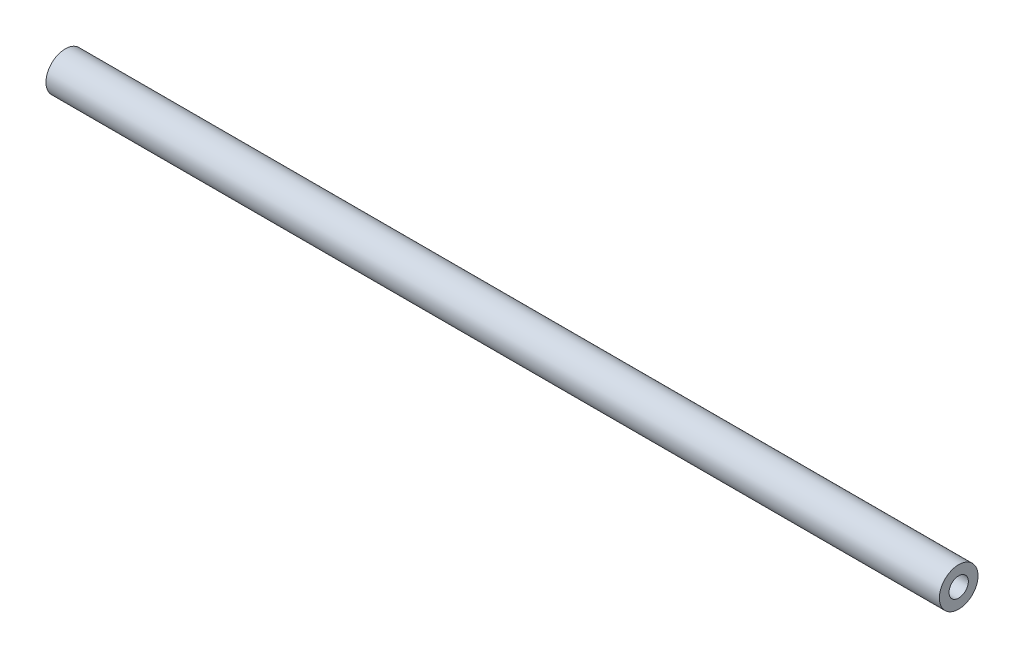
ISO-10303-21;
HEADER;
FILE_DESCRIPTION(('STEP AP214'),'2;1');
FILE_NAME('part.step','',(''),(''),'','','');
FILE_SCHEMA(('AUTOMOTIVE_DESIGN { 1 0 10303 214 1 1 1 1 }'));
ENDSEC;
DATA;
#1=APPLICATION_CONTEXT('core data for automotive mechanical design processes');
#2=APPLICATION_PROTOCOL_DEFINITION('international standard','automotive_design',2000,#1);
#3=PRODUCT_CONTEXT('',#1,'mechanical');
#4=PRODUCT('Part','Part','',(#3));
#5=PRODUCT_RELATED_PRODUCT_CATEGORY('part','',(#4));
#6=PRODUCT_DEFINITION_FORMATION('','',#4);
#7=PRODUCT_DEFINITION_CONTEXT('part definition',#1,'design');
#8=PRODUCT_DEFINITION('design','',#6,#7);
#9=PRODUCT_DEFINITION_SHAPE('','',#8);
#10=(LENGTH_UNIT() NAMED_UNIT(*) SI_UNIT(.MILLI.,.METRE.));
#11=(NAMED_UNIT(*) PLANE_ANGLE_UNIT() SI_UNIT($,.RADIAN.));
#12=(NAMED_UNIT(*) SI_UNIT($,.STERADIAN.) SOLID_ANGLE_UNIT());
#13=UNCERTAINTY_MEASURE_WITH_UNIT(LENGTH_MEASURE(1.E-05),#10,'distance_accuracy_value','');
#14=(GEOMETRIC_REPRESENTATION_CONTEXT(3) GLOBAL_UNCERTAINTY_ASSIGNED_CONTEXT((#13)) GLOBAL_UNIT_ASSIGNED_CONTEXT((#10,
#11,#12)) REPRESENTATION_CONTEXT('',''));
#15=CARTESIAN_POINT('',(0.,0.,0.));
#16=DIRECTION('',(0.,0.,1.));
#17=DIRECTION('',(1.,0.,0.));
#18=AXIS2_PLACEMENT_3D('',#15,#16,#17);
#19=CARTESIAN_POINT('',(185.,0.,0.));
#20=DIRECTION('',(1.,0.,0.));
#21=DIRECTION('',(0.,0.,-1.));
#22=AXIS2_PLACEMENT_3D('',#19,#20,#21);
#23=PLANE('',#22);
#24=CARTESIAN_POINT('',(185.,0.,0.));
#25=DIRECTION('',(1.,0.,0.));
#26=DIRECTION('',(0.,0.,-1.));
#27=AXIS2_PLACEMENT_3D('',#24,#25,#26);
#28=CIRCLE('',#27,4.);
#29=CARTESIAN_POINT('',(185.,0.,-4.));
#30=VERTEX_POINT('',#29);
#31=EDGE_CURVE('E10',#30,#30,#28,.T.);
#32=ORIENTED_EDGE('',*,*,#31,.T.);
#33=EDGE_LOOP('',(#32));
#34=FACE_BOUND('',#33,.T.);
#35=CARTESIAN_POINT('',(185.,0.,0.));
#36=DIRECTION('',(1.,0.,0.));
#37=DIRECTION('',(0.,0.,-1.));
#38=AXIS2_PLACEMENT_3D('',#35,#36,#37);
#39=CIRCLE('',#38,2.);
#40=CARTESIAN_POINT('',(185.,0.,-2.));
#41=VERTEX_POINT('',#40);
#42=EDGE_CURVE('E42',#41,#41,#39,.T.);
#43=ORIENTED_EDGE('',*,*,#42,.F.);
#44=EDGE_LOOP('',(#43));
#45=FACE_BOUND('',#44,.T.);
#46=ADVANCED_FACE('F31',(#34,#45),#23,.T.);
#47=CARTESIAN_POINT('',(0.,0.,0.));
#48=DIRECTION('',(1.,0.,0.));
#49=DIRECTION('',(0.,0.,-1.));
#50=AXIS2_PLACEMENT_3D('',#47,#48,#49);
#51=PLANE('',#50);
#52=CARTESIAN_POINT('',(0.,0.,0.));
#53=DIRECTION('',(1.,0.,0.));
#54=DIRECTION('',(0.,0.,-1.));
#55=AXIS2_PLACEMENT_3D('',#52,#53,#54);
#56=CIRCLE('',#55,4.);
#57=CARTESIAN_POINT('',(0.,0.,-4.));
#58=VERTEX_POINT('',#57);
#59=EDGE_CURVE('E35',#58,#58,#56,.T.);
#60=ORIENTED_EDGE('',*,*,#59,.F.);
#61=EDGE_LOOP('',(#60));
#62=FACE_BOUND('',#61,.T.);
#63=CARTESIAN_POINT('',(0.,0.,0.));
#64=DIRECTION('',(1.,0.,0.));
#65=DIRECTION('',(0.,0.,-1.));
#66=AXIS2_PLACEMENT_3D('',#63,#64,#65);
#67=CIRCLE('',#66,2.);
#68=CARTESIAN_POINT('',(0.,0.,-2.));
#69=VERTEX_POINT('',#68);
#70=EDGE_CURVE('E44',#69,#69,#67,.T.);
#71=ORIENTED_EDGE('',*,*,#70,.T.);
#72=EDGE_LOOP('',(#71));
#73=FACE_BOUND('',#72,.T.);
#74=ADVANCED_FACE('F54',(#62,#73),#51,.F.);
#75=CARTESIAN_POINT('',(185.,0.,0.));
#76=DIRECTION('',(-1.,0.,0.));
#77=DIRECTION('',(0.,0.,1.));
#78=AXIS2_PLACEMENT_3D('',#75,#76,#77);
#79=CYLINDRICAL_SURFACE('',#78,4.);
#80=ORIENTED_EDGE('',*,*,#31,.F.);
#81=EDGE_LOOP('',(#80));
#82=FACE_BOUND('',#81,.T.);
#83=ORIENTED_EDGE('',*,*,#59,.T.);
#84=EDGE_LOOP('',(#83));
#85=FACE_BOUND('',#84,.T.);
#86=ADVANCED_FACE('F33',(#82,#85),#79,.T.);
#87=CARTESIAN_POINT('',(185.,0.,0.));
#88=DIRECTION('',(-1.,0.,0.));
#89=DIRECTION('',(0.,0.,1.));
#90=AXIS2_PLACEMENT_3D('',#87,#88,#89);
#91=CYLINDRICAL_SURFACE('',#90,2.);
#92=ORIENTED_EDGE('',*,*,#42,.T.);
#93=EDGE_LOOP('',(#92));
#94=FACE_BOUND('',#93,.T.);
#95=ORIENTED_EDGE('',*,*,#70,.F.);
#96=EDGE_LOOP('',(#95));
#97=FACE_BOUND('',#96,.T.);
#98=ADVANCED_FACE('F50',(#94,#97),#91,.F.);
#99=CLOSED_SHELL('',(#46,#74,#86,#98));
#100=MANIFOLD_SOLID_BREP('B2',#99);
#101=ADVANCED_BREP_SHAPE_REPRESENTATION('',(#18,#100),#14);
#102=SHAPE_DEFINITION_REPRESENTATION(#9,#101);
ENDSEC;
END-ISO-10303-21;
